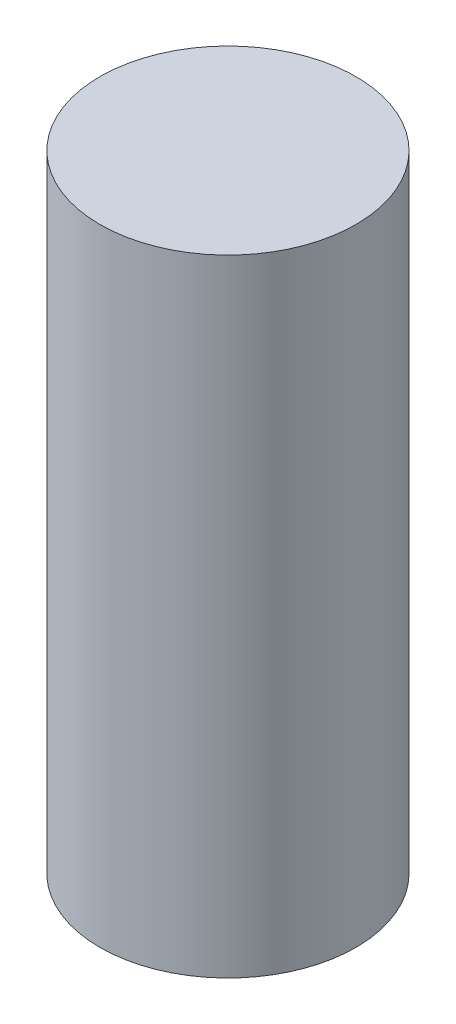
ISO-10303-21;
HEADER;
FILE_DESCRIPTION(('STEP AP214'),'2;1');
FILE_NAME('part.step','',(''),(''),'','','');
FILE_SCHEMA(('AUTOMOTIVE_DESIGN { 1 0 10303 214 1 1 1 1 }'));
ENDSEC;
DATA;
#1=APPLICATION_CONTEXT('core data for automotive mechanical design processes');
#2=APPLICATION_PROTOCOL_DEFINITION('international standard','automotive_design',2000,#1);
#3=PRODUCT_CONTEXT('',#1,'mechanical');
#4=PRODUCT('Part','Part','',(#3));
#5=PRODUCT_RELATED_PRODUCT_CATEGORY('part','',(#4));
#6=PRODUCT_DEFINITION_FORMATION('','',#4);
#7=PRODUCT_DEFINITION_CONTEXT('part definition',#1,'design');
#8=PRODUCT_DEFINITION('design','',#6,#7);
#9=PRODUCT_DEFINITION_SHAPE('','',#8);
#10=(LENGTH_UNIT() NAMED_UNIT(*) SI_UNIT(.MILLI.,.METRE.));
#11=(NAMED_UNIT(*) PLANE_ANGLE_UNIT() SI_UNIT($,.RADIAN.));
#12=(NAMED_UNIT(*) SI_UNIT($,.STERADIAN.) SOLID_ANGLE_UNIT());
#13=UNCERTAINTY_MEASURE_WITH_UNIT(LENGTH_MEASURE(1.E-05),#10,'distance_accuracy_value','');
#14=(GEOMETRIC_REPRESENTATION_CONTEXT(3) GLOBAL_UNCERTAINTY_ASSIGNED_CONTEXT((#13)) GLOBAL_UNIT_ASSIGNED_CONTEXT((#10,
#11,#12)) REPRESENTATION_CONTEXT('',''));
#15=CARTESIAN_POINT('',(0.,0.,0.));
#16=DIRECTION('',(0.,0.,1.));
#17=DIRECTION('',(1.,0.,0.));
#18=AXIS2_PLACEMENT_3D('',#15,#16,#17);
#19=CARTESIAN_POINT('',(0.,0.,0.));
#20=DIRECTION('',(0.,1.,0.));
#21=DIRECTION('',(0.,0.,1.));
#22=AXIS2_PLACEMENT_3D('',#19,#20,#21);
#23=PLANE('',#22);
#24=CARTESIAN_POINT('',(0.,0.,0.));
#25=DIRECTION('',(0.,1.,0.));
#26=DIRECTION('',(0.,0.,1.));
#27=AXIS2_PLACEMENT_3D('',#24,#25,#26);
#28=CIRCLE('',#27,13.5);
#29=CARTESIAN_POINT('',(0.,0.,13.5));
#30=VERTEX_POINT('',#29);
#31=EDGE_CURVE('E10',#30,#30,#28,.T.);
#32=ORIENTED_EDGE('',*,*,#31,.F.);
#33=EDGE_LOOP('',(#32));
#34=FACE_BOUND('',#33,.T.);
#35=CARTESIAN_POINT('',(0.,0.,0.));
#36=DIRECTION('',(0.,1.,0.));
#37=DIRECTION('',(0.,0.,1.));
#38=AXIS2_PLACEMENT_3D('',#35,#36,#37);
#39=CIRCLE('',#38,12.75);
#40=CARTESIAN_POINT('',(0.,0.,12.75));
#41=VERTEX_POINT('',#40);
#42=EDGE_CURVE('E40',#41,#41,#39,.T.);
#43=ORIENTED_EDGE('',*,*,#42,.T.);
#44=EDGE_LOOP('',(#43));
#45=FACE_BOUND('',#44,.T.);
#46=ADVANCED_FACE('F33',(#34,#45),#23,.F.);
#47=CARTESIAN_POINT('',(0.,64.,0.));
#48=DIRECTION('',(0.,-1.,0.));
#49=DIRECTION('',(0.,0.,-1.));
#50=AXIS2_PLACEMENT_3D('',#47,#48,#49);
#51=CYLINDRICAL_SURFACE('',#50,13.5);
#52=ORIENTED_EDGE('',*,*,#31,.T.);
#53=EDGE_LOOP('',(#52));
#54=FACE_BOUND('',#53,.T.);
#55=CARTESIAN_POINT('',(0.,66.,0.));
#56=DIRECTION('',(0.,1.,0.));
#57=DIRECTION('',(0.,0.,1.));
#58=AXIS2_PLACEMENT_3D('',#55,#56,#57);
#59=CIRCLE('',#58,13.5);
#60=CARTESIAN_POINT('',(0.,66.,13.5));
#61=VERTEX_POINT('',#60);
#62=EDGE_CURVE('E48',#61,#61,#59,.T.);
#63=ORIENTED_EDGE('',*,*,#62,.F.);
#64=EDGE_LOOP('',(#63));
#65=FACE_BOUND('',#64,.T.);
#66=ADVANCED_FACE('F35',(#54,#65),#51,.T.);
#67=CARTESIAN_POINT('',(0.,64.,0.));
#68=DIRECTION('',(0.,-1.,0.));
#69=DIRECTION('',(0.,0.,-1.));
#70=AXIS2_PLACEMENT_3D('',#67,#68,#69);
#71=CYLINDRICAL_SURFACE('',#70,12.75);
#72=CARTESIAN_POINT('',(0.,64.,0.));
#73=DIRECTION('',(0.,1.,0.));
#74=DIRECTION('',(0.,0.,1.));
#75=AXIS2_PLACEMENT_3D('',#72,#73,#74);
#76=CIRCLE('',#75,12.75);
#77=CARTESIAN_POINT('',(0.,64.,12.75));
#78=VERTEX_POINT('',#77);
#79=EDGE_CURVE('E44',#78,#78,#76,.T.);
#80=ORIENTED_EDGE('',*,*,#79,.T.);
#81=EDGE_LOOP('',(#80));
#82=FACE_BOUND('',#81,.T.);
#83=ORIENTED_EDGE('',*,*,#42,.F.);
#84=EDGE_LOOP('',(#83));
#85=FACE_BOUND('',#84,.T.);
#86=ADVANCED_FACE('F57',(#82,#85),#71,.F.);
#87=CARTESIAN_POINT('',(0.,64.,0.));
#88=DIRECTION('',(0.,1.,0.));
#89=DIRECTION('',(0.,0.,1.));
#90=AXIS2_PLACEMENT_3D('',#87,#88,#89);
#91=PLANE('',#90);
#92=ORIENTED_EDGE('',*,*,#79,.F.);
#93=EDGE_LOOP('',(#92));
#94=FACE_BOUND('',#93,.T.);
#95=ADVANCED_FACE('F62',(#94),#91,.F.);
#96=CARTESIAN_POINT('',(0.,66.,0.));
#97=DIRECTION('',(0.,1.,0.));
#98=DIRECTION('',(0.,0.,1.));
#99=AXIS2_PLACEMENT_3D('',#96,#97,#98);
#100=PLANE('',#99);
#101=ORIENTED_EDGE('',*,*,#62,.T.);
#102=EDGE_LOOP('',(#101));
#103=FACE_BOUND('',#102,.T.);
#104=ADVANCED_FACE('F54',(#103),#100,.T.);
#105=CLOSED_SHELL('',(#46,#66,#86,#95,#104));
#106=MANIFOLD_SOLID_BREP('B2',#105);
#107=ADVANCED_BREP_SHAPE_REPRESENTATION('',(#18,#106),#14);
#108=SHAPE_DEFINITION_REPRESENTATION(#9,#107);
ENDSEC;
END-ISO-10303-21;
